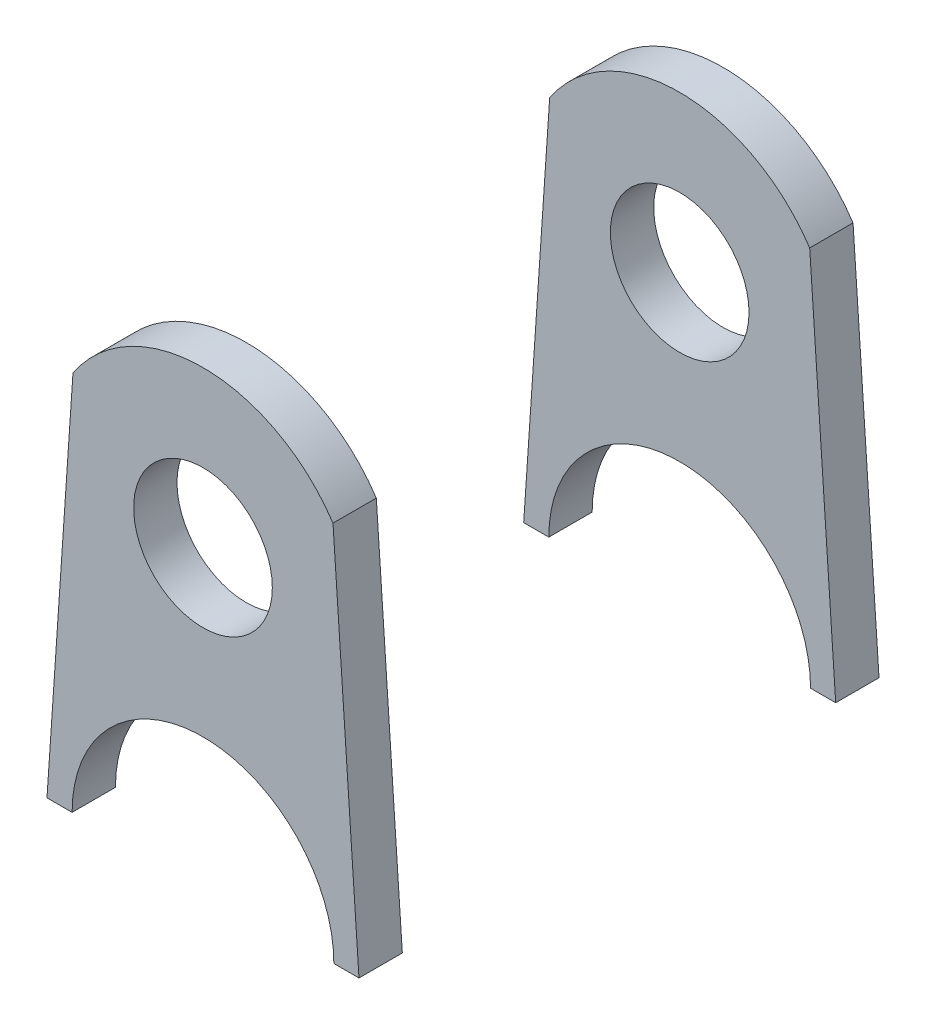
ISO-10303-21;
HEADER;
FILE_DESCRIPTION(('STEP AP214'),'2;1');
FILE_NAME('part.step','',(''),(''),'','','');
FILE_SCHEMA(('AUTOMOTIVE_DESIGN { 1 0 10303 214 1 1 1 1 }'));
ENDSEC;
DATA;
#1=APPLICATION_CONTEXT('core data for automotive mechanical design processes');
#2=APPLICATION_PROTOCOL_DEFINITION('international standard','automotive_design',2000,#1);
#3=PRODUCT_CONTEXT('',#1,'mechanical');
#4=PRODUCT('Part','Part','',(#3));
#5=PRODUCT_RELATED_PRODUCT_CATEGORY('part','',(#4));
#6=PRODUCT_DEFINITION_FORMATION('','',#4);
#7=PRODUCT_DEFINITION_CONTEXT('part definition',#1,'design');
#8=PRODUCT_DEFINITION('design','',#6,#7);
#9=PRODUCT_DEFINITION_SHAPE('','',#8);
#10=(LENGTH_UNIT() NAMED_UNIT(*) SI_UNIT(.MILLI.,.METRE.));
#11=(NAMED_UNIT(*) PLANE_ANGLE_UNIT() SI_UNIT($,.RADIAN.));
#12=(NAMED_UNIT(*) SI_UNIT($,.STERADIAN.) SOLID_ANGLE_UNIT());
#13=UNCERTAINTY_MEASURE_WITH_UNIT(LENGTH_MEASURE(1.E-05),#10,'distance_accuracy_value','');
#14=(GEOMETRIC_REPRESENTATION_CONTEXT(3) GLOBAL_UNCERTAINTY_ASSIGNED_CONTEXT((#13)) GLOBAL_UNIT_ASSIGNED_CONTEXT((#10,
#11,#12)) REPRESENTATION_CONTEXT('',''));
#15=CARTESIAN_POINT('',(0.,0.,0.));
#16=DIRECTION('',(0.,0.,1.));
#17=DIRECTION('',(1.,0.,0.));
#18=AXIS2_PLACEMENT_3D('',#15,#16,#17);
#19=CARTESIAN_POINT('',(-1.49304335801867,0.101914513708027,-15.));
#20=DIRECTION('',(0.997678424483115,-0.0681011110106795,0.));
#21=DIRECTION('',(0.0681011110106795,0.997678424483115,0.));
#22=AXIS2_PLACEMENT_3D('',#19,#20,#21);
#23=PLANE('',#22);
#24=DIRECTION('',(-0.0681011110106795,-0.997678424483115,0.));
#25=VECTOR('',#24,1.);
#26=CARTESIAN_POINT('',(-1.49304335801867,0.101914513708027,-12.5));
#27=LINE('',#26,#25);
#28=CARTESIAN_POINT('',(0.,21.9749371855327,-12.5));
#29=VERTEX_POINT('',#28);
#30=CARTESIAN_POINT('',(-1.5,0.,-12.5));
#31=VERTEX_POINT('',#30);
#32=EDGE_CURVE('E123',#29,#31,#27,.T.);
#33=ORIENTED_EDGE('',*,*,#32,.F.);
#34=DIRECTION('',(0.,0.,1.));
#35=VECTOR('',#34,1.);
#36=CARTESIAN_POINT('',(0.,21.9749371855327,-15.));
#37=LINE('',#36,#35);
#38=CARTESIAN_POINT('',(0.,21.9749371855327,-15.));
#39=VERTEX_POINT('',#38);
#40=EDGE_CURVE('E138',#39,#29,#37,.T.);
#41=ORIENTED_EDGE('',*,*,#40,.F.);
#42=DIRECTION('',(0.0681011110106795,0.997678424483115,0.));
#43=VECTOR('',#42,1.);
#44=CARTESIAN_POINT('',(-1.49304335801867,0.101914513708027,-15.));
#45=LINE('',#44,#43);
#46=CARTESIAN_POINT('',(-1.5,0.,-15.));
#47=VERTEX_POINT('',#46);
#48=EDGE_CURVE('E89',#47,#39,#45,.T.);
#49=ORIENTED_EDGE('',*,*,#48,.F.);
#50=DIRECTION('',(0.,0.,1.));
#51=VECTOR('',#50,1.);
#52=CARTESIAN_POINT('',(-1.5,0.,-15.));
#53=LINE('',#52,#51);
#54=EDGE_CURVE('E136',#47,#31,#53,.T.);
#55=ORIENTED_EDGE('',*,*,#54,.T.);
#56=EDGE_LOOP('',(#33,#41,#49,#55));
#57=FACE_BOUND('',#56,.T.);
#58=ADVANCED_FACE('F47',(#57),#23,.F.);
#59=CARTESIAN_POINT('',(7.5,17.,-15.));
#60=DIRECTION('',(0.,0.,1.));
#61=DIRECTION('',(1.,0.,0.));
#62=AXIS2_PLACEMENT_3D('',#59,#60,#61);
#63=CYLINDRICAL_SURFACE('',#62,8.99999999999985);
#64=ORIENTED_EDGE('',*,*,#40,.T.);
#65=CARTESIAN_POINT('',(7.5,17.,-12.5));
#66=DIRECTION('',(0.,0.,1.));
#67=DIRECTION('',(1.,0.,0.));
#68=AXIS2_PLACEMENT_3D('',#65,#66,#67);
#69=CIRCLE('',#68,8.99999999999985);
#70=CARTESIAN_POINT('',(14.9999999999999,21.9749371855331,-12.5));
#71=VERTEX_POINT('',#70);
#72=EDGE_CURVE('E70',#29,#71,#69,.F.);
#73=ORIENTED_EDGE('',*,*,#72,.T.);
#74=DIRECTION('',(0.,0.,1.));
#75=VECTOR('',#74,1.);
#76=CARTESIAN_POINT('',(14.9999999999999,21.9749371855331,-15.));
#77=LINE('',#76,#75);
#78=CARTESIAN_POINT('',(14.9999999999999,21.9749371855331,-15.));
#79=VERTEX_POINT('',#78);
#80=EDGE_CURVE('E129',#79,#71,#77,.T.);
#81=ORIENTED_EDGE('',*,*,#80,.F.);
#82=CARTESIAN_POINT('',(7.5,17.,-15.));
#83=DIRECTION('',(0.,0.,1.));
#84=DIRECTION('',(1.,0.,0.));
#85=AXIS2_PLACEMENT_3D('',#82,#83,#84);
#86=CIRCLE('',#85,8.99999999999985);
#87=EDGE_CURVE('E120',#79,#39,#86,.T.);
#88=ORIENTED_EDGE('',*,*,#87,.T.);
#89=EDGE_LOOP('',(#64,#73,#81,#88));
#90=FACE_BOUND('',#89,.T.);
#91=ADVANCED_FACE('F160',(#90),#63,.T.);
#92=CARTESIAN_POINT('',(16.4234769382053,1.12105965078836,-15.));
#93=DIRECTION('',(-0.997678424483115,-0.0681011110106835,0.));
#94=DIRECTION('',(0.0681011110106835,-0.997678424483115,0.));
#95=AXIS2_PLACEMENT_3D('',#92,#93,#94);
#96=PLANE('',#95);
#97=DIRECTION('',(-0.0681011110106835,0.997678424483115,0.));
#98=VECTOR('',#97,1.);
#99=CARTESIAN_POINT('',(16.4234769382053,1.12105965078836,-12.5));
#100=LINE('',#99,#98);
#101=CARTESIAN_POINT('',(16.5,0.,-12.5));
#102=VERTEX_POINT('',#101);
#103=EDGE_CURVE('E127',#102,#71,#100,.T.);
#104=ORIENTED_EDGE('',*,*,#103,.F.);
#105=DIRECTION('',(0.,0.,1.));
#106=VECTOR('',#105,1.);
#107=CARTESIAN_POINT('',(16.5,0.,-15.));
#108=LINE('',#107,#106);
#109=CARTESIAN_POINT('',(16.5,0.,-15.));
#110=VERTEX_POINT('',#109);
#111=EDGE_CURVE('E82',#110,#102,#108,.T.);
#112=ORIENTED_EDGE('',*,*,#111,.F.);
#113=DIRECTION('',(0.0681011110106835,-0.997678424483115,0.));
#114=VECTOR('',#113,1.);
#115=CARTESIAN_POINT('',(16.4234769382053,1.12105965078836,-15.));
#116=LINE('',#115,#114);
#117=EDGE_CURVE('E117',#79,#110,#116,.T.);
#118=ORIENTED_EDGE('',*,*,#117,.F.);
#119=ORIENTED_EDGE('',*,*,#80,.T.);
#120=EDGE_LOOP('',(#104,#112,#118,#119));
#121=FACE_BOUND('',#120,.T.);
#122=ADVANCED_FACE('F126',(#121),#96,.F.);
#123=CARTESIAN_POINT('',(7.5,0.,-15.));
#124=DIRECTION('',(0.,0.,1.));
#125=DIRECTION('',(1.,0.,0.));
#126=AXIS2_PLACEMENT_3D('',#123,#124,#125);
#127=CYLINDRICAL_SURFACE('',#126,7.55);
#128=CARTESIAN_POINT('',(7.5,0.,-12.5));
#129=DIRECTION('',(0.,0.,1.));
#130=DIRECTION('',(1.,0.,0.));
#131=AXIS2_PLACEMENT_3D('',#128,#129,#130);
#132=CIRCLE('',#131,7.55);
#133=CARTESIAN_POINT('',(-0.0499999999999997,0.,-12.5));
#134=VERTEX_POINT('',#133);
#135=CARTESIAN_POINT('',(15.05,0.,-12.5));
#136=VERTEX_POINT('',#135);
#137=EDGE_CURVE('E150',#134,#136,#132,.F.);
#138=ORIENTED_EDGE('',*,*,#137,.F.);
#139=DIRECTION('',(0.,0.,1.));
#140=VECTOR('',#139,1.);
#141=CARTESIAN_POINT('',(-0.0499999999999997,0.,-15.));
#142=LINE('',#141,#140);
#143=CARTESIAN_POINT('',(-0.0500000000000014,0.,-15.));
#144=VERTEX_POINT('',#143);
#145=EDGE_CURVE('E61',#134,#144,#142,.F.);
#146=ORIENTED_EDGE('',*,*,#145,.T.);
#147=CARTESIAN_POINT('',(7.5,0.,-15.));
#148=DIRECTION('',(0.,0.,1.));
#149=DIRECTION('',(1.,0.,0.));
#150=AXIS2_PLACEMENT_3D('',#147,#148,#149);
#151=CIRCLE('',#150,7.55);
#152=CARTESIAN_POINT('',(15.05,0.,-15.));
#153=VERTEX_POINT('',#152);
#154=EDGE_CURVE('E132',#153,#144,#151,.T.);
#155=ORIENTED_EDGE('',*,*,#154,.F.);
#156=DIRECTION('',(0.,0.,1.));
#157=VECTOR('',#156,1.);
#158=CARTESIAN_POINT('',(15.05,0.,-15.));
#159=LINE('',#158,#157);
#160=EDGE_CURVE('E111',#153,#136,#159,.T.);
#161=ORIENTED_EDGE('',*,*,#160,.T.);
#162=EDGE_LOOP('',(#138,#146,#155,#161));
#163=FACE_BOUND('',#162,.T.);
#164=ADVANCED_FACE('F161',(#163),#127,.F.);
#165=CARTESIAN_POINT('',(7.5,17.,-15.));
#166=DIRECTION('',(0.,0.,1.));
#167=DIRECTION('',(1.,0.,0.));
#168=AXIS2_PLACEMENT_3D('',#165,#166,#167);
#169=CYLINDRICAL_SURFACE('',#168,4.);
#170=CARTESIAN_POINT('',(7.5,17.,-15.));
#171=DIRECTION('',(0.,0.,1.));
#172=DIRECTION('',(1.,0.,0.));
#173=AXIS2_PLACEMENT_3D('',#170,#171,#172);
#174=CIRCLE('',#173,4.);
#175=CARTESIAN_POINT('',(11.5,17.,-15.));
#176=VERTEX_POINT('',#175);
#177=EDGE_CURVE('E128',#176,#176,#174,.T.);
#178=ORIENTED_EDGE('',*,*,#177,.F.);
#179=EDGE_LOOP('',(#178));
#180=FACE_BOUND('',#179,.T.);
#181=CARTESIAN_POINT('',(7.5,17.,-12.5));
#182=DIRECTION('',(0.,0.,1.));
#183=DIRECTION('',(1.,0.,0.));
#184=AXIS2_PLACEMENT_3D('',#181,#182,#183);
#185=CIRCLE('',#184,4.);
#186=CARTESIAN_POINT('',(11.5,17.,-12.5));
#187=VERTEX_POINT('',#186);
#188=EDGE_CURVE('E152',#187,#187,#185,.F.);
#189=ORIENTED_EDGE('',*,*,#188,.F.);
#190=EDGE_LOOP('',(#189));
#191=FACE_BOUND('',#190,.T.);
#192=ADVANCED_FACE('F180',(#180,#191),#169,.F.);
#193=CARTESIAN_POINT('',(0.,0.,-15.));
#194=DIRECTION('',(0.,0.,1.));
#195=DIRECTION('',(1.,0.,0.));
#196=AXIS2_PLACEMENT_3D('',#193,#194,#195);
#197=PLANE('',#196);
#198=ORIENTED_EDGE('',*,*,#177,.T.);
#199=EDGE_LOOP('',(#198));
#200=FACE_BOUND('',#199,.T.);
#201=ORIENTED_EDGE('',*,*,#117,.T.);
#202=DIRECTION('',(-1.,0.,0.));
#203=VECTOR('',#202,1.);
#204=CARTESIAN_POINT('',(19.3059398634938,0.,-15.));
#205=LINE('',#204,#203);
#206=EDGE_CURVE('E107',#110,#153,#205,.T.);
#207=ORIENTED_EDGE('',*,*,#206,.T.);
#208=ORIENTED_EDGE('',*,*,#154,.T.);
#209=EDGE_CURVE('E114',#144,#47,#205,.T.);
#210=ORIENTED_EDGE('',*,*,#209,.T.);
#211=ORIENTED_EDGE('',*,*,#48,.T.);
#212=ORIENTED_EDGE('',*,*,#87,.F.);
#213=EDGE_LOOP('',(#201,#207,#208,#210,#211,#212));
#214=FACE_BOUND('',#213,.T.);
#215=ADVANCED_FACE('F118',(#200,#214),#197,.F.);
#216=CARTESIAN_POINT('',(16.5,25.9999999999998,-12.5));
#217=DIRECTION('',(0.,0.,1.));
#218=DIRECTION('',(1.,0.,0.));
#219=AXIS2_PLACEMENT_3D('',#216,#217,#218);
#220=PLANE('',#219);
#221=DIRECTION('',(-1.,0.,0.));
#222=VECTOR('',#221,1.);
#223=CARTESIAN_POINT('',(16.5,0.,-12.5));
#224=LINE('',#223,#222);
#225=EDGE_CURVE('E12',#102,#136,#224,.T.);
#226=ORIENTED_EDGE('',*,*,#225,.F.);
#227=ORIENTED_EDGE('',*,*,#103,.T.);
#228=ORIENTED_EDGE('',*,*,#72,.F.);
#229=ORIENTED_EDGE('',*,*,#32,.T.);
#230=EDGE_CURVE('E50',#134,#31,#224,.T.);
#231=ORIENTED_EDGE('',*,*,#230,.F.);
#232=ORIENTED_EDGE('',*,*,#137,.T.);
#233=EDGE_LOOP('',(#226,#227,#228,#229,#231,#232));
#234=FACE_BOUND('',#233,.T.);
#235=ORIENTED_EDGE('',*,*,#188,.T.);
#236=EDGE_LOOP('',(#235));
#237=FACE_BOUND('',#236,.T.);
#238=ADVANCED_FACE('F157',(#234,#237),#220,.T.);
#239=CARTESIAN_POINT('',(7.5,0.,-15.));
#240=DIRECTION('',(0.,1.,0.));
#241=DIRECTION('',(0.,0.,1.));
#242=AXIS2_PLACEMENT_3D('',#239,#240,#241);
#243=PLANE('',#242);
#244=ORIENTED_EDGE('',*,*,#230,.T.);
#245=ORIENTED_EDGE('',*,*,#54,.F.);
#246=ORIENTED_EDGE('',*,*,#209,.F.);
#247=ORIENTED_EDGE('',*,*,#145,.F.);
#248=EDGE_LOOP('',(#244,#245,#246,#247));
#249=FACE_BOUND('',#248,.T.);
#250=ADVANCED_FACE('F162',(#249),#243,.F.);
#251=ORIENTED_EDGE('',*,*,#206,.F.);
#252=ORIENTED_EDGE('',*,*,#111,.T.);
#253=ORIENTED_EDGE('',*,*,#225,.T.);
#254=ORIENTED_EDGE('',*,*,#160,.F.);
#255=EDGE_LOOP('',(#251,#252,#253,#254));
#256=FACE_BOUND('',#255,.T.);
#257=ADVANCED_FACE('F109',(#256),#243,.F.);
#258=CLOSED_SHELL('',(#58,#91,#122,#164,#192,#215,#238,#250,#257));
#259=MANIFOLD_SOLID_BREP('B2',#258);
#260=CARTESIAN_POINT('',(7.5,0.,-15.));
#261=DIRECTION('',(0.,0.,1.));
#262=DIRECTION('',(1.,0.,0.));
#263=AXIS2_PLACEMENT_3D('',#260,#261,#262);
#264=CYLINDRICAL_SURFACE('',#263,7.55);
#265=CARTESIAN_POINT('',(7.5,0.,15.));
#266=DIRECTION('',(0.,0.,1.));
#267=DIRECTION('',(1.,0.,0.));
#268=AXIS2_PLACEMENT_3D('',#265,#266,#267);
#269=CIRCLE('',#268,7.55);
#270=CARTESIAN_POINT('',(15.05,0.,15.));
#271=VERTEX_POINT('',#270);
#272=CARTESIAN_POINT('',(-0.0499999999999997,0.,15.));
#273=VERTEX_POINT('',#272);
#274=EDGE_CURVE('E333',#271,#273,#269,.T.);
#275=ORIENTED_EDGE('',*,*,#274,.T.);
#276=DIRECTION('',(0.,0.,1.));
#277=VECTOR('',#276,1.);
#278=CARTESIAN_POINT('',(-0.0499999999999997,0.,-15.));
#279=LINE('',#278,#277);
#280=CARTESIAN_POINT('',(-0.0499999999999997,0.,12.5));
#281=VERTEX_POINT('',#280);
#282=EDGE_CURVE('E347',#273,#281,#279,.F.);
#283=ORIENTED_EDGE('',*,*,#282,.T.);
#284=CARTESIAN_POINT('',(7.5,0.,12.5));
#285=DIRECTION('',(0.,0.,-1.));
#286=DIRECTION('',(-1.,0.,0.));
#287=AXIS2_PLACEMENT_3D('',#284,#285,#286);
#288=CIRCLE('',#287,7.55);
#289=CARTESIAN_POINT('',(15.05,0.,12.5));
#290=VERTEX_POINT('',#289);
#291=EDGE_CURVE('E339',#290,#281,#288,.F.);
#292=ORIENTED_EDGE('',*,*,#291,.F.);
#293=DIRECTION('',(0.,0.,1.));
#294=VECTOR('',#293,1.);
#295=CARTESIAN_POINT('',(15.05,0.,-15.));
#296=LINE('',#295,#294);
#297=EDGE_CURVE('E262',#290,#271,#296,.T.);
#298=ORIENTED_EDGE('',*,*,#297,.T.);
#299=EDGE_LOOP('',(#275,#283,#292,#298));
#300=FACE_BOUND('',#299,.T.);
#301=ADVANCED_FACE('F247',(#300),#264,.F.);
#302=CARTESIAN_POINT('',(7.5,17.,-15.));
#303=DIRECTION('',(0.,0.,1.));
#304=DIRECTION('',(1.,0.,0.));
#305=AXIS2_PLACEMENT_3D('',#302,#303,#304);
#306=CYLINDRICAL_SURFACE('',#305,4.);
#307=CARTESIAN_POINT('',(7.5,17.,15.));
#308=DIRECTION('',(0.,0.,1.));
#309=DIRECTION('',(1.,0.,0.));
#310=AXIS2_PLACEMENT_3D('',#307,#308,#309);
#311=CIRCLE('',#310,4.);
#312=CARTESIAN_POINT('',(11.5,17.,15.));
#313=VERTEX_POINT('',#312);
#314=EDGE_CURVE('E336',#313,#313,#311,.T.);
#315=ORIENTED_EDGE('',*,*,#314,.T.);
#316=EDGE_LOOP('',(#315));
#317=FACE_BOUND('',#316,.T.);
#318=CARTESIAN_POINT('',(7.5,17.,12.5));
#319=DIRECTION('',(0.,0.,-1.));
#320=DIRECTION('',(-1.,0.,0.));
#321=AXIS2_PLACEMENT_3D('',#318,#319,#320);
#322=CIRCLE('',#321,4.);
#323=CARTESIAN_POINT('',(3.5,17.,12.5));
#324=VERTEX_POINT('',#323);
#325=EDGE_CURVE('E341',#324,#324,#322,.F.);
#326=ORIENTED_EDGE('',*,*,#325,.F.);
#327=EDGE_LOOP('',(#326));
#328=FACE_BOUND('',#327,.T.);
#329=ADVANCED_FACE('F249',(#317,#328),#306,.F.);
#330=CARTESIAN_POINT('',(0.,0.,15.));
#331=DIRECTION('',(0.,0.,1.));
#332=DIRECTION('',(1.,0.,0.));
#333=AXIS2_PLACEMENT_3D('',#330,#331,#332);
#334=PLANE('',#333);
#335=DIRECTION('',(-1.,0.,0.));
#336=VECTOR('',#335,1.);
#337=CARTESIAN_POINT('',(0.,0.,15.));
#338=LINE('',#337,#336);
#339=CARTESIAN_POINT('',(16.5,0.,15.));
#340=VERTEX_POINT('',#339);
#341=EDGE_CURVE('E350',#340,#271,#338,.T.);
#342=ORIENTED_EDGE('',*,*,#341,.F.);
#343=DIRECTION('',(0.0681011110106835,-0.997678424483115,0.));
#344=VECTOR('',#343,1.);
#345=CARTESIAN_POINT('',(16.4234769382053,1.12105965078836,15.));
#346=LINE('',#345,#344);
#347=CARTESIAN_POINT('',(14.9999999999999,21.9749371855331,15.));
#348=VERTEX_POINT('',#347);
#349=EDGE_CURVE('E319',#348,#340,#346,.T.);
#350=ORIENTED_EDGE('',*,*,#349,.F.);
#351=CARTESIAN_POINT('',(7.5,17.,15.));
#352=DIRECTION('',(0.,0.,1.));
#353=DIRECTION('',(1.,0.,0.));
#354=AXIS2_PLACEMENT_3D('',#351,#352,#353);
#355=CIRCLE('',#354,8.99999999999985);
#356=CARTESIAN_POINT('',(0.,21.9749371855327,15.));
#357=VERTEX_POINT('',#356);
#358=EDGE_CURVE('E325',#348,#357,#355,.T.);
#359=ORIENTED_EDGE('',*,*,#358,.T.);
#360=DIRECTION('',(0.0681011110106795,0.997678424483115,0.));
#361=VECTOR('',#360,1.);
#362=CARTESIAN_POINT('',(-1.49304335801867,0.101914513708027,15.));
#363=LINE('',#362,#361);
#364=CARTESIAN_POINT('',(-1.5,0.,15.));
#365=VERTEX_POINT('',#364);
#366=EDGE_CURVE('E330',#365,#357,#363,.T.);
#367=ORIENTED_EDGE('',*,*,#366,.F.);
#368=EDGE_CURVE('E314',#273,#365,#338,.T.);
#369=ORIENTED_EDGE('',*,*,#368,.F.);
#370=ORIENTED_EDGE('',*,*,#274,.F.);
#371=EDGE_LOOP('',(#342,#350,#359,#367,#369,#370));
#372=FACE_BOUND('',#371,.T.);
#373=ORIENTED_EDGE('',*,*,#314,.F.);
#374=EDGE_LOOP('',(#373));
#375=FACE_BOUND('',#374,.T.);
#376=ADVANCED_FACE('F356',(#372,#375),#334,.T.);
#377=CARTESIAN_POINT('',(16.4234769382053,1.12105965078836,-15.));
#378=DIRECTION('',(-0.997678424483115,-0.0681011110106835,0.));
#379=DIRECTION('',(0.0681011110106835,-0.997678424483115,0.));
#380=AXIS2_PLACEMENT_3D('',#377,#378,#379);
#381=PLANE('',#380);
#382=DIRECTION('',(0.0681011110106835,-0.997678424483115,0.));
#383=VECTOR('',#382,1.);
#384=CARTESIAN_POINT('',(16.4234769382053,1.12105965078836,12.5));
#385=LINE('',#384,#383);
#386=CARTESIAN_POINT('',(14.9999999999999,21.9749371855331,12.5));
#387=VERTEX_POINT('',#386);
#388=CARTESIAN_POINT('',(16.5,0.,12.5));
#389=VERTEX_POINT('',#388);
#390=EDGE_CURVE('E306',#387,#389,#385,.T.);
#391=ORIENTED_EDGE('',*,*,#390,.F.);
#392=DIRECTION('',(0.,0.,1.));
#393=VECTOR('',#392,1.);
#394=CARTESIAN_POINT('',(14.9999999999999,21.9749371855331,-15.));
#395=LINE('',#394,#393);
#396=EDGE_CURVE('E320',#387,#348,#395,.T.);
#397=ORIENTED_EDGE('',*,*,#396,.T.);
#398=ORIENTED_EDGE('',*,*,#349,.T.);
#399=DIRECTION('',(0.,0.,1.));
#400=VECTOR('',#399,1.);
#401=CARTESIAN_POINT('',(16.5,0.,-15.));
#402=LINE('',#401,#400);
#403=EDGE_CURVE('E300',#389,#340,#402,.T.);
#404=ORIENTED_EDGE('',*,*,#403,.F.);
#405=EDGE_LOOP('',(#391,#397,#398,#404));
#406=FACE_BOUND('',#405,.T.);
#407=ADVANCED_FACE('F317',(#406),#381,.F.);
#408=CARTESIAN_POINT('',(7.5,17.,-15.));
#409=DIRECTION('',(0.,0.,1.));
#410=DIRECTION('',(1.,0.,0.));
#411=AXIS2_PLACEMENT_3D('',#408,#409,#410);
#412=CYLINDRICAL_SURFACE('',#411,8.99999999999985);
#413=ORIENTED_EDGE('',*,*,#396,.F.);
#414=CARTESIAN_POINT('',(7.5,17.,12.5));
#415=DIRECTION('',(0.,0.,-1.));
#416=DIRECTION('',(-1.,0.,0.));
#417=AXIS2_PLACEMENT_3D('',#414,#415,#416);
#418=CIRCLE('',#417,8.99999999999985);
#419=CARTESIAN_POINT('',(0.,21.9749371855327,12.5));
#420=VERTEX_POINT('',#419);
#421=EDGE_CURVE('E311',#387,#420,#418,.F.);
#422=ORIENTED_EDGE('',*,*,#421,.T.);
#423=DIRECTION('',(0.,0.,1.));
#424=VECTOR('',#423,1.);
#425=CARTESIAN_POINT('',(0.,21.9749371855327,-15.));
#426=LINE('',#425,#424);
#427=EDGE_CURVE('E270',#420,#357,#426,.T.);
#428=ORIENTED_EDGE('',*,*,#427,.T.);
#429=ORIENTED_EDGE('',*,*,#358,.F.);
#430=EDGE_LOOP('',(#413,#422,#428,#429));
#431=FACE_BOUND('',#430,.T.);
#432=ADVANCED_FACE('F365',(#431),#412,.T.);
#433=CARTESIAN_POINT('',(-1.49304335801867,0.101914513708027,-15.));
#434=DIRECTION('',(0.997678424483115,-0.0681011110106795,0.));
#435=DIRECTION('',(0.0681011110106795,0.997678424483115,0.));
#436=AXIS2_PLACEMENT_3D('',#433,#434,#435);
#437=PLANE('',#436);
#438=DIRECTION('',(0.0681011110106795,0.997678424483115,0.));
#439=VECTOR('',#438,1.);
#440=CARTESIAN_POINT('',(-1.49304335801867,0.101914513708026,12.5));
#441=LINE('',#440,#439);
#442=CARTESIAN_POINT('',(-1.5,0.,12.5));
#443=VERTEX_POINT('',#442);
#444=EDGE_CURVE('E344',#443,#420,#441,.T.);
#445=ORIENTED_EDGE('',*,*,#444,.F.);
#446=DIRECTION('',(0.,0.,1.));
#447=VECTOR('',#446,1.);
#448=CARTESIAN_POINT('',(-1.5,0.,-15.));
#449=LINE('',#448,#447);
#450=EDGE_CURVE('E321',#443,#365,#449,.T.);
#451=ORIENTED_EDGE('',*,*,#450,.T.);
#452=ORIENTED_EDGE('',*,*,#366,.T.);
#453=ORIENTED_EDGE('',*,*,#427,.F.);
#454=EDGE_LOOP('',(#445,#451,#452,#453));
#455=FACE_BOUND('',#454,.T.);
#456=ADVANCED_FACE('F363',(#455),#437,.F.);
#457=CARTESIAN_POINT('',(-1.5,25.9999999999998,12.5));
#458=DIRECTION('',(0.,0.,-1.));
#459=DIRECTION('',(-1.,0.,0.));
#460=AXIS2_PLACEMENT_3D('',#457,#458,#459);
#461=PLANE('',#460);
#462=DIRECTION('',(1.,0.,0.));
#463=VECTOR('',#462,1.);
#464=CARTESIAN_POINT('',(-1.5,0.,12.5));
#465=LINE('',#464,#463);
#466=EDGE_CURVE('E45',#443,#281,#465,.T.);
#467=ORIENTED_EDGE('',*,*,#466,.F.);
#468=ORIENTED_EDGE('',*,*,#444,.T.);
#469=ORIENTED_EDGE('',*,*,#421,.F.);
#470=ORIENTED_EDGE('',*,*,#390,.T.);
#471=EDGE_CURVE('E251',#290,#389,#465,.T.);
#472=ORIENTED_EDGE('',*,*,#471,.F.);
#473=ORIENTED_EDGE('',*,*,#291,.T.);
#474=EDGE_LOOP('',(#467,#468,#469,#470,#472,#473));
#475=FACE_BOUND('',#474,.T.);
#476=ORIENTED_EDGE('',*,*,#325,.T.);
#477=EDGE_LOOP('',(#476));
#478=FACE_BOUND('',#477,.T.);
#479=ADVANCED_FACE('F308',(#475,#478),#461,.T.);
#480=CARTESIAN_POINT('',(7.5,0.,-15.));
#481=DIRECTION('',(0.,1.,0.));
#482=DIRECTION('',(0.,0.,1.));
#483=AXIS2_PLACEMENT_3D('',#480,#481,#482);
#484=PLANE('',#483);
#485=ORIENTED_EDGE('',*,*,#341,.T.);
#486=ORIENTED_EDGE('',*,*,#297,.F.);
#487=ORIENTED_EDGE('',*,*,#471,.T.);
#488=ORIENTED_EDGE('',*,*,#403,.T.);
#489=EDGE_LOOP('',(#485,#486,#487,#488));
#490=FACE_BOUND('',#489,.T.);
#491=ADVANCED_FACE('F298',(#490),#484,.F.);
#492=ORIENTED_EDGE('',*,*,#368,.T.);
#493=ORIENTED_EDGE('',*,*,#450,.F.);
#494=ORIENTED_EDGE('',*,*,#466,.T.);
#495=ORIENTED_EDGE('',*,*,#282,.F.);
#496=EDGE_LOOP('',(#492,#493,#494,#495));
#497=FACE_BOUND('',#496,.T.);
#498=ADVANCED_FACE('F360',(#497),#484,.F.);
#499=CLOSED_SHELL('',(#301,#329,#376,#407,#432,#456,#479,#491,#498));
#500=MANIFOLD_SOLID_BREP('B6',#499);
#501=ADVANCED_BREP_SHAPE_REPRESENTATION('',(#18,#259,#500),#14);
#502=SHAPE_DEFINITION_REPRESENTATION(#9,#501);
ENDSEC;
END-ISO-10303-21;
